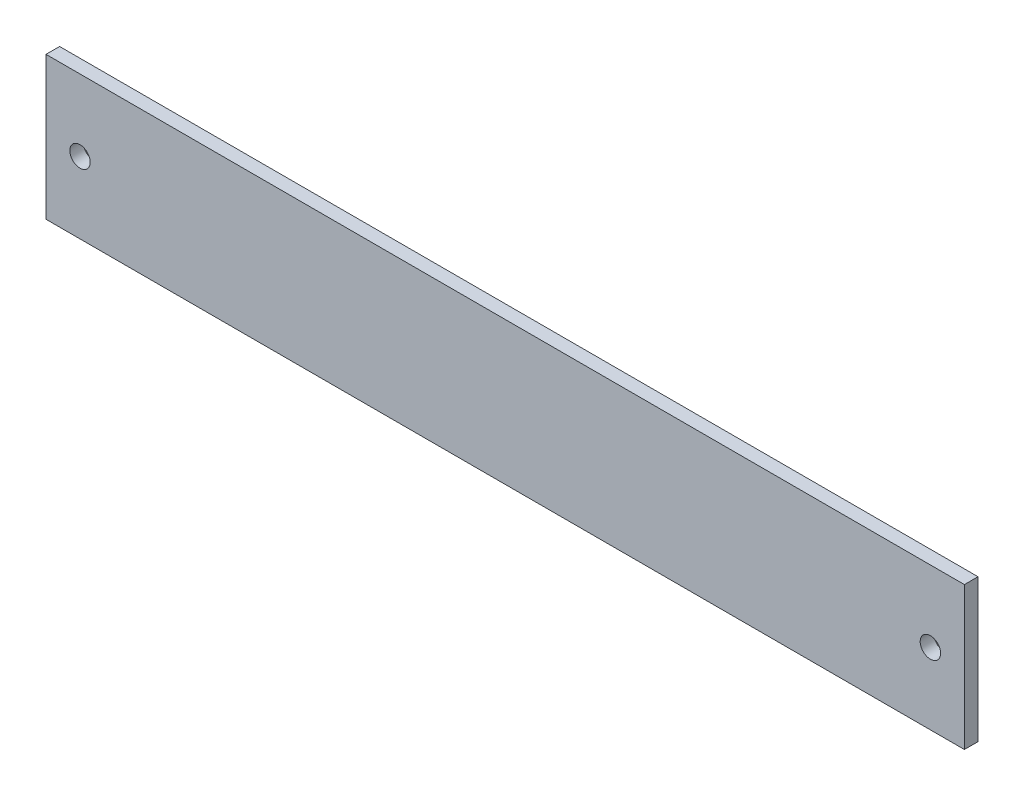
ISO-10303-21;
HEADER;
FILE_DESCRIPTION(('STEP AP214'),'2;1');
FILE_NAME('part.step','',(''),(''),'','','');
FILE_SCHEMA(('AUTOMOTIVE_DESIGN { 1 0 10303 214 1 1 1 1 }'));
ENDSEC;
DATA;
#1=APPLICATION_CONTEXT('core data for automotive mechanical design processes');
#2=APPLICATION_PROTOCOL_DEFINITION('international standard','automotive_design',2000,#1);
#3=PRODUCT_CONTEXT('',#1,'mechanical');
#4=PRODUCT('Part','Part','',(#3));
#5=PRODUCT_RELATED_PRODUCT_CATEGORY('part','',(#4));
#6=PRODUCT_DEFINITION_FORMATION('','',#4);
#7=PRODUCT_DEFINITION_CONTEXT('part definition',#1,'design');
#8=PRODUCT_DEFINITION('design','',#6,#7);
#9=PRODUCT_DEFINITION_SHAPE('','',#8);
#10=(LENGTH_UNIT() NAMED_UNIT(*) SI_UNIT(.MILLI.,.METRE.));
#11=(NAMED_UNIT(*) PLANE_ANGLE_UNIT() SI_UNIT($,.RADIAN.));
#12=(NAMED_UNIT(*) SI_UNIT($,.STERADIAN.) SOLID_ANGLE_UNIT());
#13=UNCERTAINTY_MEASURE_WITH_UNIT(LENGTH_MEASURE(1.E-05),#10,'distance_accuracy_value','');
#14=(GEOMETRIC_REPRESENTATION_CONTEXT(3) GLOBAL_UNCERTAINTY_ASSIGNED_CONTEXT((#13)) GLOBAL_UNIT_ASSIGNED_CONTEXT((#10,
#11,#12)) REPRESENTATION_CONTEXT('',''));
#15=CARTESIAN_POINT('',(0.,0.,0.));
#16=DIRECTION('',(0.,0.,1.));
#17=DIRECTION('',(1.,0.,0.));
#18=AXIS2_PLACEMENT_3D('',#15,#16,#17);
#19=CARTESIAN_POINT('',(0.,0.,2.));
#20=DIRECTION('',(0.,0.,1.));
#21=DIRECTION('',(1.,0.,0.));
#22=AXIS2_PLACEMENT_3D('',#19,#20,#21);
#23=PLANE('',#22);
#24=CARTESIAN_POINT('',(-62.5,0.,2.));
#25=DIRECTION('',(0.,0.,1.));
#26=DIRECTION('',(1.,0.,0.));
#27=AXIS2_PLACEMENT_3D('',#24,#25,#26);
#28=CIRCLE('',#27,1.5);
#29=CARTESIAN_POINT('',(-61.,0.,2.));
#30=VERTEX_POINT('',#29);
#31=EDGE_CURVE('E118',#30,#30,#28,.T.);
#32=ORIENTED_EDGE('',*,*,#31,.F.);
#33=EDGE_LOOP('',(#32));
#34=FACE_BOUND('',#33,.T.);
#35=DIRECTION('',(0.,-1.,0.));
#36=VECTOR('',#35,1.);
#37=CARTESIAN_POINT('',(-67.5,-10.5,2.));
#38=LINE('',#37,#36);
#39=CARTESIAN_POINT('',(-67.5,10.5,2.));
#40=VERTEX_POINT('',#39);
#41=CARTESIAN_POINT('',(-67.5,-10.5,2.));
#42=VERTEX_POINT('',#41);
#43=EDGE_CURVE('E98',#40,#42,#38,.T.);
#44=ORIENTED_EDGE('',*,*,#43,.T.);
#45=DIRECTION('',(1.,0.,0.));
#46=VECTOR('',#45,1.);
#47=CARTESIAN_POINT('',(67.5,-10.5,2.));
#48=LINE('',#47,#46);
#49=CARTESIAN_POINT('',(67.5,-10.5,2.));
#50=VERTEX_POINT('',#49);
#51=EDGE_CURVE('E93',#42,#50,#48,.T.);
#52=ORIENTED_EDGE('',*,*,#51,.T.);
#53=DIRECTION('',(0.,1.,0.));
#54=VECTOR('',#53,1.);
#55=CARTESIAN_POINT('',(67.5,-10.5,2.));
#56=LINE('',#55,#54);
#57=CARTESIAN_POINT('',(67.5,10.5,2.));
#58=VERTEX_POINT('',#57);
#59=EDGE_CURVE('E96',#50,#58,#56,.T.);
#60=ORIENTED_EDGE('',*,*,#59,.T.);
#61=DIRECTION('',(-1.,0.,0.));
#62=VECTOR('',#61,1.);
#63=CARTESIAN_POINT('',(67.5,10.5,2.));
#64=LINE('',#63,#62);
#65=EDGE_CURVE('E63',#58,#40,#64,.T.);
#66=ORIENTED_EDGE('',*,*,#65,.T.);
#67=EDGE_LOOP('',(#44,#52,#60,#66));
#68=FACE_BOUND('',#67,.T.);
#69=CARTESIAN_POINT('',(62.5,0.,2.));
#70=DIRECTION('',(0.,0.,1.));
#71=DIRECTION('',(1.,0.,0.));
#72=AXIS2_PLACEMENT_3D('',#69,#70,#71);
#73=CIRCLE('',#72,1.49999999999999);
#74=CARTESIAN_POINT('',(64.,0.,2.));
#75=VERTEX_POINT('',#74);
#76=EDGE_CURVE('E140',#75,#75,#73,.T.);
#77=ORIENTED_EDGE('',*,*,#76,.F.);
#78=EDGE_LOOP('',(#77));
#79=FACE_BOUND('',#78,.T.);
#80=ADVANCED_FACE('F45',(#34,#68,#79),#23,.T.);
#81=CARTESIAN_POINT('',(0.,0.,0.));
#82=DIRECTION('',(0.,0.,1.));
#83=DIRECTION('',(1.,0.,0.));
#84=AXIS2_PLACEMENT_3D('',#81,#82,#83);
#85=PLANE('',#84);
#86=DIRECTION('',(0.,-1.,0.));
#87=VECTOR('',#86,1.);
#88=CARTESIAN_POINT('',(-67.5,-10.5,0.));
#89=LINE('',#88,#87);
#90=CARTESIAN_POINT('',(-67.5,10.5,0.));
#91=VERTEX_POINT('',#90);
#92=CARTESIAN_POINT('',(-67.5,-10.5,0.));
#93=VERTEX_POINT('',#92);
#94=EDGE_CURVE('E114',#91,#93,#89,.T.);
#95=ORIENTED_EDGE('',*,*,#94,.F.);
#96=DIRECTION('',(-1.,0.,0.));
#97=VECTOR('',#96,1.);
#98=CARTESIAN_POINT('',(67.5,10.5,0.));
#99=LINE('',#98,#97);
#100=CARTESIAN_POINT('',(67.5,10.5,0.));
#101=VERTEX_POINT('',#100);
#102=EDGE_CURVE('E86',#101,#91,#99,.T.);
#103=ORIENTED_EDGE('',*,*,#102,.F.);
#104=DIRECTION('',(0.,1.,0.));
#105=VECTOR('',#104,1.);
#106=CARTESIAN_POINT('',(67.5,-10.5,0.));
#107=LINE('',#106,#105);
#108=CARTESIAN_POINT('',(67.5,-10.5,0.));
#109=VERTEX_POINT('',#108);
#110=EDGE_CURVE('E80',#109,#101,#107,.T.);
#111=ORIENTED_EDGE('',*,*,#110,.F.);
#112=DIRECTION('',(1.,0.,0.));
#113=VECTOR('',#112,1.);
#114=CARTESIAN_POINT('',(67.5,-10.5,0.));
#115=LINE('',#114,#113);
#116=EDGE_CURVE('E103',#93,#109,#115,.T.);
#117=ORIENTED_EDGE('',*,*,#116,.F.);
#118=EDGE_LOOP('',(#95,#103,#111,#117));
#119=FACE_BOUND('',#118,.T.);
#120=CARTESIAN_POINT('',(-62.5,0.,0.));
#121=DIRECTION('',(0.,0.,1.));
#122=DIRECTION('',(1.,0.,0.));
#123=AXIS2_PLACEMENT_3D('',#120,#121,#122);
#124=CIRCLE('',#123,1.5);
#125=CARTESIAN_POINT('',(-61.,0.,0.));
#126=VERTEX_POINT('',#125);
#127=EDGE_CURVE('E136',#126,#126,#124,.T.);
#128=ORIENTED_EDGE('',*,*,#127,.T.);
#129=EDGE_LOOP('',(#128));
#130=FACE_BOUND('',#129,.T.);
#131=CARTESIAN_POINT('',(62.5,0.,0.));
#132=DIRECTION('',(0.,0.,1.));
#133=DIRECTION('',(1.,0.,0.));
#134=AXIS2_PLACEMENT_3D('',#131,#132,#133);
#135=CIRCLE('',#134,1.49999999999999);
#136=CARTESIAN_POINT('',(64.,0.,0.));
#137=VERTEX_POINT('',#136);
#138=EDGE_CURVE('E144',#137,#137,#135,.T.);
#139=ORIENTED_EDGE('',*,*,#138,.T.);
#140=EDGE_LOOP('',(#139));
#141=FACE_BOUND('',#140,.T.);
#142=ADVANCED_FACE('F131',(#119,#130,#141),#85,.F.);
#143=CARTESIAN_POINT('',(-67.5,-10.5,2.));
#144=DIRECTION('',(1.,0.,0.));
#145=DIRECTION('',(0.,0.,-1.));
#146=AXIS2_PLACEMENT_3D('',#143,#144,#145);
#147=PLANE('',#146);
#148=ORIENTED_EDGE('',*,*,#94,.T.);
#149=DIRECTION('',(0.,0.,-1.));
#150=VECTOR('',#149,1.);
#151=CARTESIAN_POINT('',(-67.5,-10.5,2.));
#152=LINE('',#151,#150);
#153=EDGE_CURVE('E11',#42,#93,#152,.T.);
#154=ORIENTED_EDGE('',*,*,#153,.F.);
#155=ORIENTED_EDGE('',*,*,#43,.F.);
#156=DIRECTION('',(0.,0.,-1.));
#157=VECTOR('',#156,1.);
#158=CARTESIAN_POINT('',(-67.5,10.5,2.));
#159=LINE('',#158,#157);
#160=EDGE_CURVE('E110',#40,#91,#159,.T.);
#161=ORIENTED_EDGE('',*,*,#160,.T.);
#162=EDGE_LOOP('',(#148,#154,#155,#161));
#163=FACE_BOUND('',#162,.T.);
#164=ADVANCED_FACE('F47',(#163),#147,.F.);
#165=CARTESIAN_POINT('',(67.5,-10.5,2.));
#166=DIRECTION('',(0.,1.,0.));
#167=DIRECTION('',(-1.,0.,0.));
#168=AXIS2_PLACEMENT_3D('',#165,#166,#167);
#169=PLANE('',#168);
#170=ORIENTED_EDGE('',*,*,#116,.T.);
#171=DIRECTION('',(0.,0.,-1.));
#172=VECTOR('',#171,1.);
#173=CARTESIAN_POINT('',(67.5,-10.5,2.));
#174=LINE('',#173,#172);
#175=EDGE_CURVE('E55',#50,#109,#174,.T.);
#176=ORIENTED_EDGE('',*,*,#175,.F.);
#177=ORIENTED_EDGE('',*,*,#51,.F.);
#178=ORIENTED_EDGE('',*,*,#153,.T.);
#179=EDGE_LOOP('',(#170,#176,#177,#178));
#180=FACE_BOUND('',#179,.T.);
#181=ADVANCED_FACE('F102',(#180),#169,.F.);
#182=CARTESIAN_POINT('',(67.5,-10.5,2.));
#183=DIRECTION('',(-1.,0.,0.));
#184=DIRECTION('',(0.,0.,1.));
#185=AXIS2_PLACEMENT_3D('',#182,#183,#184);
#186=PLANE('',#185);
#187=ORIENTED_EDGE('',*,*,#110,.T.);
#188=DIRECTION('',(0.,0.,-1.));
#189=VECTOR('',#188,1.);
#190=CARTESIAN_POINT('',(67.5,10.5,2.));
#191=LINE('',#190,#189);
#192=EDGE_CURVE('E105',#58,#101,#191,.T.);
#193=ORIENTED_EDGE('',*,*,#192,.F.);
#194=ORIENTED_EDGE('',*,*,#59,.F.);
#195=ORIENTED_EDGE('',*,*,#175,.T.);
#196=EDGE_LOOP('',(#187,#193,#194,#195));
#197=FACE_BOUND('',#196,.T.);
#198=ADVANCED_FACE('F106',(#197),#186,.F.);
#199=CARTESIAN_POINT('',(67.5,10.5,2.));
#200=DIRECTION('',(0.,-1.,0.));
#201=DIRECTION('',(1.,0.,0.));
#202=AXIS2_PLACEMENT_3D('',#199,#200,#201);
#203=PLANE('',#202);
#204=ORIENTED_EDGE('',*,*,#102,.T.);
#205=ORIENTED_EDGE('',*,*,#160,.F.);
#206=ORIENTED_EDGE('',*,*,#65,.F.);
#207=ORIENTED_EDGE('',*,*,#192,.T.);
#208=EDGE_LOOP('',(#204,#205,#206,#207));
#209=FACE_BOUND('',#208,.T.);
#210=ADVANCED_FACE('F128',(#209),#203,.F.);
#211=CARTESIAN_POINT('',(-62.5,0.,2.));
#212=DIRECTION('',(0.,0.,-1.));
#213=DIRECTION('',(-1.,0.,0.));
#214=AXIS2_PLACEMENT_3D('',#211,#212,#213);
#215=CYLINDRICAL_SURFACE('',#214,1.5);
#216=ORIENTED_EDGE('',*,*,#31,.T.);
#217=EDGE_LOOP('',(#216));
#218=FACE_BOUND('',#217,.T.);
#219=ORIENTED_EDGE('',*,*,#127,.F.);
#220=EDGE_LOOP('',(#219));
#221=FACE_BOUND('',#220,.T.);
#222=ADVANCED_FACE('F163',(#218,#221),#215,.F.);
#223=CARTESIAN_POINT('',(62.5,0.,2.));
#224=DIRECTION('',(0.,0.,-1.));
#225=DIRECTION('',(-1.,0.,0.));
#226=AXIS2_PLACEMENT_3D('',#223,#224,#225);
#227=CYLINDRICAL_SURFACE('',#226,1.49999999999999);
#228=ORIENTED_EDGE('',*,*,#76,.T.);
#229=EDGE_LOOP('',(#228));
#230=FACE_BOUND('',#229,.T.);
#231=ORIENTED_EDGE('',*,*,#138,.F.);
#232=EDGE_LOOP('',(#231));
#233=FACE_BOUND('',#232,.T.);
#234=ADVANCED_FACE('F152',(#230,#233),#227,.F.);
#235=CLOSED_SHELL('',(#80,#142,#164,#181,#198,#210,#222,#234));
#236=MANIFOLD_SOLID_BREP('B2',#235);
#237=ADVANCED_BREP_SHAPE_REPRESENTATION('',(#18,#236),#14);
#238=SHAPE_DEFINITION_REPRESENTATION(#9,#237);
ENDSEC;
END-ISO-10303-21;
